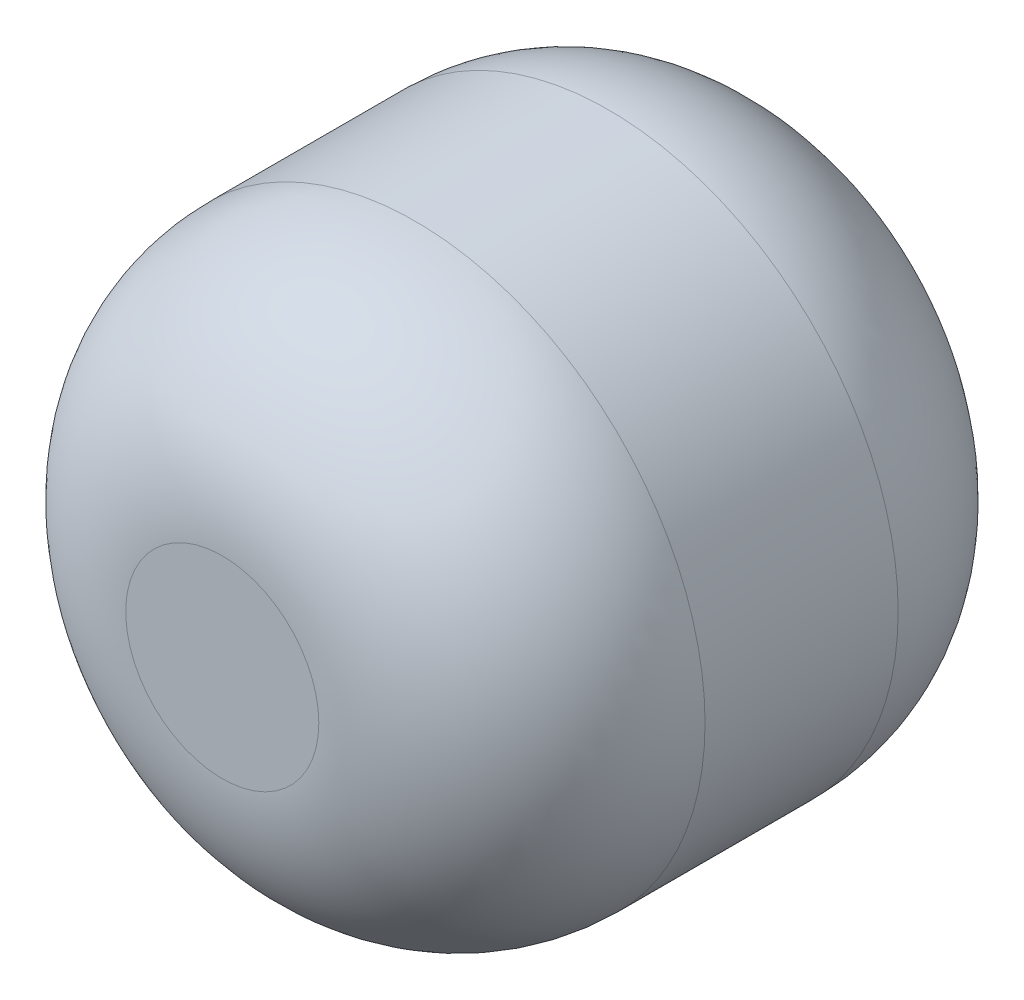
ISO-10303-21;
HEADER;
FILE_DESCRIPTION(('STEP AP214'),'2;1');
FILE_NAME('part.step','',(''),(''),'','','');
FILE_SCHEMA(('AUTOMOTIVE_DESIGN { 1 0 10303 214 1 1 1 1 }'));
ENDSEC;
DATA;
#1=APPLICATION_CONTEXT('core data for automotive mechanical design processes');
#2=APPLICATION_PROTOCOL_DEFINITION('international standard','automotive_design',2000,#1);
#3=PRODUCT_CONTEXT('',#1,'mechanical');
#4=PRODUCT('Part','Part','',(#3));
#5=PRODUCT_RELATED_PRODUCT_CATEGORY('part','',(#4));
#6=PRODUCT_DEFINITION_FORMATION('','',#4);
#7=PRODUCT_DEFINITION_CONTEXT('part definition',#1,'design');
#8=PRODUCT_DEFINITION('design','',#6,#7);
#9=PRODUCT_DEFINITION_SHAPE('','',#8);
#10=(LENGTH_UNIT() NAMED_UNIT(*) SI_UNIT(.MILLI.,.METRE.));
#11=(NAMED_UNIT(*) PLANE_ANGLE_UNIT() SI_UNIT($,.RADIAN.));
#12=(NAMED_UNIT(*) SI_UNIT($,.STERADIAN.) SOLID_ANGLE_UNIT());
#13=UNCERTAINTY_MEASURE_WITH_UNIT(LENGTH_MEASURE(1.E-05),#10,'distance_accuracy_value','');
#14=(GEOMETRIC_REPRESENTATION_CONTEXT(3) GLOBAL_UNCERTAINTY_ASSIGNED_CONTEXT((#13)) GLOBAL_UNIT_ASSIGNED_CONTEXT((#10,
#11,#12)) REPRESENTATION_CONTEXT('',''));
#15=CARTESIAN_POINT('',(0.,0.,0.));
#16=DIRECTION('',(0.,0.,1.));
#17=DIRECTION('',(1.,0.,0.));
#18=AXIS2_PLACEMENT_3D('',#15,#16,#17);
#19=CARTESIAN_POINT('',(0.,0.,76.2));
#20=DIRECTION('',(0.,0.,-1.));
#21=DIRECTION('',(-1.,0.,0.));
#22=AXIS2_PLACEMENT_3D('',#19,#20,#21);
#23=CYLINDRICAL_SURFACE('',#22,38.1);
#24=CARTESIAN_POINT('',(0.,0.,25.4));
#25=DIRECTION('',(0.,0.,1.));
#26=DIRECTION('',(1.,0.,0.));
#27=AXIS2_PLACEMENT_3D('',#24,#25,#26);
#28=CIRCLE('',#27,38.1);
#29=CARTESIAN_POINT('',(-38.1,0.,25.4));
#30=VERTEX_POINT('',#29);
#31=EDGE_CURVE('E42',#30,#30,#28,.T.);
#32=CARTESIAN_POINT('',(0.,0.,50.8));
#33=DIRECTION('',(0.,0.,1.));
#34=DIRECTION('',(1.,0.,0.));
#35=AXIS2_PLACEMENT_3D('',#32,#33,#34);
#36=CIRCLE('',#35,38.1);
#37=CARTESIAN_POINT('',(-38.1,0.,50.8));
#38=VERTEX_POINT('',#37);
#39=EDGE_CURVE('E46',#38,#38,#36,.F.);
#40=CARTESIAN_POINT('',(-38.1,0.,25.4));
#41=CARTESIAN_POINT('',(-38.1,0.,25.6645833333333));
#42=CARTESIAN_POINT('',(-38.1,0.,25.9291666666666));
#43=CARTESIAN_POINT('',(-38.1,0.,26.4583333333333));
#44=CARTESIAN_POINT('',(-38.1,0.,26.7229166666666));
#45=CARTESIAN_POINT('',(-38.1,0.,27.2520833333333));
#46=CARTESIAN_POINT('',(-38.1,0.,27.5166666666666));
#47=CARTESIAN_POINT('',(-38.1,0.,28.0458333333333));
#48=CARTESIAN_POINT('',(-38.1,0.,28.3104166666666));
#49=CARTESIAN_POINT('',(-38.1,0.,28.8395833333333));
#50=CARTESIAN_POINT('',(-38.1,0.,29.1041666666666));
#51=CARTESIAN_POINT('',(-38.1,0.,29.6333333333333));
#52=CARTESIAN_POINT('',(-38.1,0.,29.8979166666666));
#53=CARTESIAN_POINT('',(-38.1,0.,30.4270833333333));
#54=CARTESIAN_POINT('',(-38.1,0.,30.6916666666666));
#55=CARTESIAN_POINT('',(-38.1,0.,31.2208333333333));
#56=CARTESIAN_POINT('',(-38.1,0.,31.4854166666666));
#57=CARTESIAN_POINT('',(-38.1,0.,32.0145833333333));
#58=CARTESIAN_POINT('',(-38.1,0.,32.2791666666666));
#59=CARTESIAN_POINT('',(-38.1,0.,32.8083333333333));
#60=CARTESIAN_POINT('',(-38.1,0.,33.0729166666666));
#61=CARTESIAN_POINT('',(-38.1,0.,33.6020833333333));
#62=CARTESIAN_POINT('',(-38.1,0.,33.8666666666666));
#63=CARTESIAN_POINT('',(-38.1,0.,34.3958333333333));
#64=CARTESIAN_POINT('',(-38.1,0.,34.6604166666666));
#65=CARTESIAN_POINT('',(-38.1,0.,35.1895833333333));
#66=CARTESIAN_POINT('',(-38.1,0.,35.4541666666666));
#67=CARTESIAN_POINT('',(-38.1,0.,35.9833333333333));
#68=CARTESIAN_POINT('',(-38.1,0.,36.2479166666666));
#69=CARTESIAN_POINT('',(-38.1,0.,36.7770833333333));
#70=CARTESIAN_POINT('',(-38.1,0.,37.0416666666666));
#71=CARTESIAN_POINT('',(-38.1,0.,37.5708333333333));
#72=CARTESIAN_POINT('',(-38.1,0.,37.8354166666666));
#73=CARTESIAN_POINT('',(-38.1,0.,38.3645833333333));
#74=CARTESIAN_POINT('',(-38.1,0.,38.6291666666666));
#75=CARTESIAN_POINT('',(-38.1,0.,39.1583333333333));
#76=CARTESIAN_POINT('',(-38.1,0.,39.4229166666666));
#77=CARTESIAN_POINT('',(-38.1,0.,39.9520833333333));
#78=CARTESIAN_POINT('',(-38.1,0.,40.2166666666666));
#79=CARTESIAN_POINT('',(-38.1,0.,40.7458333333333));
#80=CARTESIAN_POINT('',(-38.1,0.,41.0104166666667));
#81=CARTESIAN_POINT('',(-38.1,0.,41.5395833333333));
#82=CARTESIAN_POINT('',(-38.1,0.,41.8041666666666));
#83=CARTESIAN_POINT('',(-38.1,0.,42.3333333333333));
#84=CARTESIAN_POINT('',(-38.1,0.,42.5979166666666));
#85=CARTESIAN_POINT('',(-38.1,0.,43.1270833333333));
#86=CARTESIAN_POINT('',(-38.1,0.,43.3916666666667));
#87=CARTESIAN_POINT('',(-38.1,0.,43.9208333333333));
#88=CARTESIAN_POINT('',(-38.1,0.,44.1854166666666));
#89=CARTESIAN_POINT('',(-38.1,0.,44.7145833333333));
#90=CARTESIAN_POINT('',(-38.1,0.,44.9791666666667));
#91=CARTESIAN_POINT('',(-38.1,0.,45.5083333333333));
#92=CARTESIAN_POINT('',(-38.1,0.,45.7729166666666));
#93=CARTESIAN_POINT('',(-38.1,0.,46.3020833333333));
#94=CARTESIAN_POINT('',(-38.1,0.,46.5666666666666));
#95=CARTESIAN_POINT('',(-38.1,0.,47.0958333333333));
#96=CARTESIAN_POINT('',(-38.1,0.,47.3604166666667));
#97=CARTESIAN_POINT('',(-38.1,0.,47.8895833333333));
#98=CARTESIAN_POINT('',(-38.1,0.,48.1541666666666));
#99=CARTESIAN_POINT('',(-38.1,0.,48.6833333333333));
#100=CARTESIAN_POINT('',(-38.1,0.,48.9479166666667));
#101=CARTESIAN_POINT('',(-38.1,0.,49.4770833333333));
#102=CARTESIAN_POINT('',(-38.1,0.,49.7416666666667));
#103=CARTESIAN_POINT('',(-38.1,0.,50.2708333333333));
#104=CARTESIAN_POINT('',(-38.1,0.,50.5354166666666));
#105=CARTESIAN_POINT('',(-38.1,0.,50.8));
#106=B_SPLINE_CURVE_WITH_KNOTS('',3,(#40,#41,#42,#43,#44,#45,#46,#47,#48,#49,#50,#51,#52,#53,
#54,#55,#56,#57,#58,#59,#60,#61,#62,#63,#64,#65,#66,#67,#68,#69,#70,#71,#72,#73,#74,#75,#76,#77,
#78,#79,#80,#81,#82,#83,#84,#85,#86,#87,#88,#89,#90,#91,#92,#93,#94,#95,#96,#97,#98,#99,#100,
#101,#102,#103,#104,#105),.UNSPECIFIED.,.F.,.F.,(4,2,2,2,2,2,2,2,2,2,2,2,2,2,2,2,2,2,2,2,2,2,2,
2,2,2,2,2,2,2,2,2,4),(0.,0.793750000000003,1.5875,2.38125,3.175,3.96875000000001,4.7625,
5.55625000000001,6.35000000000001,7.14375,7.93750000000001,8.73125000000001,9.52500000000001,
10.31875,11.1125,11.90625,12.7,13.49375,14.2875,15.08125,15.875,16.66875,17.4625,18.25625,19.05,
19.84375,20.6375,21.43125,22.225,23.01875,23.8125,24.60625,25.4),.UNSPECIFIED.);
#107=EDGE_CURVE('BSEAM31',#30,#38,#106,.T.);
#108=ORIENTED_EDGE('',*,*,#31,.T.);
#109=ORIENTED_EDGE('',*,*,#39,.T.);
#110=ORIENTED_EDGE('',*,*,#107,.T.);
#111=ORIENTED_EDGE('',*,*,#107,.F.);
#112=EDGE_LOOP('',(#108,#110,#109,#111));
#113=FACE_BOUND('',#112,.T.);
#114=ADVANCED_FACE('F31',(#113),#23,.T.);
#115=CARTESIAN_POINT('',(0.,0.,76.2));
#116=DIRECTION('',(0.,0.,1.));
#117=DIRECTION('',(1.,0.,0.));
#118=AXIS2_PLACEMENT_3D('',#115,#116,#117);
#119=PLANE('',#118);
#120=CARTESIAN_POINT('',(0.,0.,76.2));
#121=DIRECTION('',(0.,0.,1.));
#122=DIRECTION('',(1.,0.,0.));
#123=AXIS2_PLACEMENT_3D('',#120,#121,#122);
#124=CIRCLE('',#123,12.7);
#125=CARTESIAN_POINT('',(12.7,0.,76.2));
#126=VERTEX_POINT('',#125);
#127=EDGE_CURVE('E10',#126,#126,#124,.T.);
#128=ORIENTED_EDGE('',*,*,#127,.T.);
#129=EDGE_LOOP('',(#128));
#130=FACE_BOUND('',#129,.T.);
#131=ADVANCED_FACE('F62',(#130),#119,.T.);
#132=CARTESIAN_POINT('',(0.,0.,0.));
#133=DIRECTION('',(0.,0.,1.));
#134=DIRECTION('',(1.,0.,0.));
#135=AXIS2_PLACEMENT_3D('',#132,#133,#134);
#136=PLANE('',#135);
#137=CARTESIAN_POINT('',(0.,0.,0.));
#138=DIRECTION('',(0.,0.,1.));
#139=DIRECTION('',(1.,0.,0.));
#140=AXIS2_PLACEMENT_3D('',#137,#138,#139);
#141=CIRCLE('',#140,12.7);
#142=CARTESIAN_POINT('',(12.7,0.,0.));
#143=VERTEX_POINT('',#142);
#144=EDGE_CURVE('E38',#143,#143,#141,.F.);
#145=ORIENTED_EDGE('',*,*,#144,.T.);
#146=EDGE_LOOP('',(#145));
#147=FACE_BOUND('',#146,.T.);
#148=ADVANCED_FACE('F59',(#147),#136,.F.);
#149=CARTESIAN_POINT('',(0.,0.,25.4));
#150=DIRECTION('',(0.,0.,1.));
#151=DIRECTION('',(1.,0.,0.));
#152=AXIS2_PLACEMENT_3D('',#149,#150,#151);
#153=DEGENERATE_TOROIDAL_SURFACE('',#152,12.7,25.4,.T.);
#154=ORIENTED_EDGE('',*,*,#144,.F.);
#155=EDGE_LOOP('',(#154));
#156=FACE_BOUND('',#155,.T.);
#157=ORIENTED_EDGE('',*,*,#31,.F.);
#158=EDGE_LOOP('',(#157));
#159=FACE_BOUND('',#158,.T.);
#160=ADVANCED_FACE('F55',(#156,#159),#153,.T.);
#161=CARTESIAN_POINT('',(0.,0.,50.8));
#162=DIRECTION('',(0.,0.,1.));
#163=DIRECTION('',(1.,0.,0.));
#164=AXIS2_PLACEMENT_3D('',#161,#162,#163);
#165=DEGENERATE_TOROIDAL_SURFACE('',#164,12.7,25.4,.T.);
#166=ORIENTED_EDGE('',*,*,#39,.F.);
#167=EDGE_LOOP('',(#166));
#168=FACE_BOUND('',#167,.T.);
#169=ORIENTED_EDGE('',*,*,#127,.F.);
#170=EDGE_LOOP('',(#169));
#171=FACE_BOUND('',#170,.T.);
#172=ADVANCED_FACE('F33',(#168,#171),#165,.T.);
#173=CLOSED_SHELL('',(#114,#131,#148,#160,#172));
#174=MANIFOLD_SOLID_BREP('B2',#173);
#175=ADVANCED_BREP_SHAPE_REPRESENTATION('',(#18,#174),#14);
#176=SHAPE_DEFINITION_REPRESENTATION(#9,#175);
ENDSEC;
END-ISO-10303-21;
